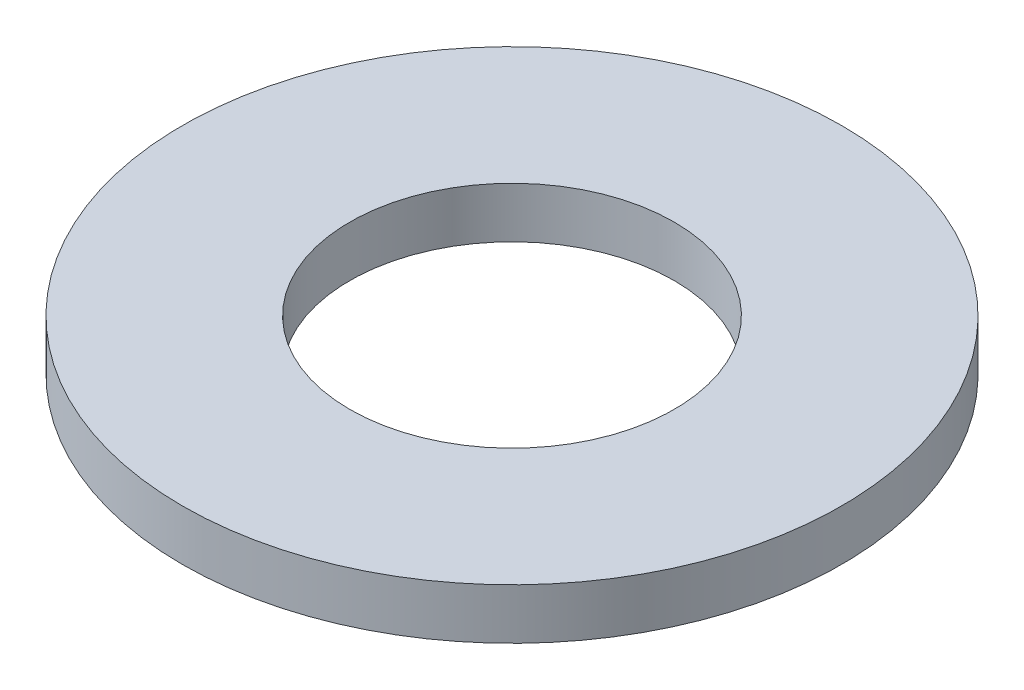
ISO-10303-21;
HEADER;
FILE_DESCRIPTION(('STEP AP214'),'2;1');
FILE_NAME('part.step','',(''),(''),'','','');
FILE_SCHEMA(('AUTOMOTIVE_DESIGN { 1 0 10303 214 1 1 1 1 }'));
ENDSEC;
DATA;
#1=APPLICATION_CONTEXT('core data for automotive mechanical design processes');
#2=APPLICATION_PROTOCOL_DEFINITION('international standard','automotive_design',2000,#1);
#3=PRODUCT_CONTEXT('',#1,'mechanical');
#4=PRODUCT('Part','Part','',(#3));
#5=PRODUCT_RELATED_PRODUCT_CATEGORY('part','',(#4));
#6=PRODUCT_DEFINITION_FORMATION('','',#4);
#7=PRODUCT_DEFINITION_CONTEXT('part definition',#1,'design');
#8=PRODUCT_DEFINITION('design','',#6,#7);
#9=PRODUCT_DEFINITION_SHAPE('','',#8);
#10=(LENGTH_UNIT() NAMED_UNIT(*) SI_UNIT(.MILLI.,.METRE.));
#11=(NAMED_UNIT(*) PLANE_ANGLE_UNIT() SI_UNIT($,.RADIAN.));
#12=(NAMED_UNIT(*) SI_UNIT($,.STERADIAN.) SOLID_ANGLE_UNIT());
#13=UNCERTAINTY_MEASURE_WITH_UNIT(LENGTH_MEASURE(1.E-05),#10,'distance_accuracy_value','');
#14=(GEOMETRIC_REPRESENTATION_CONTEXT(3) GLOBAL_UNCERTAINTY_ASSIGNED_CONTEXT((#13)) GLOBAL_UNIT_ASSIGNED_CONTEXT((#10,
#11,#12)) REPRESENTATION_CONTEXT('',''));
#15=CARTESIAN_POINT('',(0.,0.,0.));
#16=DIRECTION('',(0.,0.,1.));
#17=DIRECTION('',(1.,0.,0.));
#18=AXIS2_PLACEMENT_3D('',#15,#16,#17);
#19=CARTESIAN_POINT('',(0.,0.5,0.));
#20=DIRECTION('',(0.,1.,0.));
#21=DIRECTION('',(0.,0.,1.));
#22=AXIS2_PLACEMENT_3D('',#19,#20,#21);
#23=PLANE('',#22);
#24=CARTESIAN_POINT('',(0.,0.5,0.));
#25=DIRECTION('',(0.,1.,0.));
#26=DIRECTION('',(0.,0.,1.));
#27=AXIS2_PLACEMENT_3D('',#24,#25,#26);
#28=CIRCLE('',#27,3.25);
#29=CARTESIAN_POINT('',(0.,0.5,3.25));
#30=VERTEX_POINT('',#29);
#31=EDGE_CURVE('E10',#30,#30,#28,.T.);
#32=ORIENTED_EDGE('',*,*,#31,.T.);
#33=EDGE_LOOP('',(#32));
#34=FACE_BOUND('',#33,.T.);
#35=CARTESIAN_POINT('',(0.,0.5,0.));
#36=DIRECTION('',(0.,1.,0.));
#37=DIRECTION('',(0.,0.,1.));
#38=AXIS2_PLACEMENT_3D('',#35,#36,#37);
#39=CIRCLE('',#38,1.6);
#40=CARTESIAN_POINT('',(0.,0.5,1.6));
#41=VERTEX_POINT('',#40);
#42=EDGE_CURVE('E44',#41,#41,#39,.T.);
#43=ORIENTED_EDGE('',*,*,#42,.F.);
#44=EDGE_LOOP('',(#43));
#45=FACE_BOUND('',#44,.T.);
#46=ADVANCED_FACE('F33',(#34,#45),#23,.T.);
#47=CARTESIAN_POINT('',(0.,0.,0.));
#48=DIRECTION('',(0.,1.,0.));
#49=DIRECTION('',(0.,0.,1.));
#50=AXIS2_PLACEMENT_3D('',#47,#48,#49);
#51=PLANE('',#50);
#52=CARTESIAN_POINT('',(0.,0.,0.));
#53=DIRECTION('',(0.,1.,0.));
#54=DIRECTION('',(0.,0.,1.));
#55=AXIS2_PLACEMENT_3D('',#52,#53,#54);
#56=CIRCLE('',#55,3.25);
#57=CARTESIAN_POINT('',(0.,0.,3.25));
#58=VERTEX_POINT('',#57);
#59=EDGE_CURVE('E37',#58,#58,#56,.T.);
#60=ORIENTED_EDGE('',*,*,#59,.F.);
#61=EDGE_LOOP('',(#60));
#62=FACE_BOUND('',#61,.T.);
#63=CARTESIAN_POINT('',(0.,0.,0.));
#64=DIRECTION('',(0.,1.,0.));
#65=DIRECTION('',(0.,0.,1.));
#66=AXIS2_PLACEMENT_3D('',#63,#64,#65);
#67=CIRCLE('',#66,1.6);
#68=CARTESIAN_POINT('',(0.,0.,1.6));
#69=VERTEX_POINT('',#68);
#70=EDGE_CURVE('E46',#69,#69,#67,.T.);
#71=ORIENTED_EDGE('',*,*,#70,.T.);
#72=EDGE_LOOP('',(#71));
#73=FACE_BOUND('',#72,.T.);
#74=ADVANCED_FACE('F56',(#62,#73),#51,.F.);
#75=CARTESIAN_POINT('',(0.,0.5,0.));
#76=DIRECTION('',(0.,-1.,0.));
#77=DIRECTION('',(0.,0.,-1.));
#78=AXIS2_PLACEMENT_3D('',#75,#76,#77);
#79=CYLINDRICAL_SURFACE('',#78,3.25);
#80=ORIENTED_EDGE('',*,*,#31,.F.);
#81=EDGE_LOOP('',(#80));
#82=FACE_BOUND('',#81,.T.);
#83=ORIENTED_EDGE('',*,*,#59,.T.);
#84=EDGE_LOOP('',(#83));
#85=FACE_BOUND('',#84,.T.);
#86=ADVANCED_FACE('F35',(#82,#85),#79,.T.);
#87=CARTESIAN_POINT('',(0.,0.5,0.));
#88=DIRECTION('',(0.,-1.,0.));
#89=DIRECTION('',(0.,0.,-1.));
#90=AXIS2_PLACEMENT_3D('',#87,#88,#89);
#91=CYLINDRICAL_SURFACE('',#90,1.6);
#92=ORIENTED_EDGE('',*,*,#42,.T.);
#93=EDGE_LOOP('',(#92));
#94=FACE_BOUND('',#93,.T.);
#95=ORIENTED_EDGE('',*,*,#70,.F.);
#96=EDGE_LOOP('',(#95));
#97=FACE_BOUND('',#96,.T.);
#98=ADVANCED_FACE('F52',(#94,#97),#91,.F.);
#99=CLOSED_SHELL('',(#46,#74,#86,#98));
#100=MANIFOLD_SOLID_BREP('B2',#99);
#101=ADVANCED_BREP_SHAPE_REPRESENTATION('',(#18,#100),#14);
#102=SHAPE_DEFINITION_REPRESENTATION(#9,#101);
ENDSEC;
END-ISO-10303-21;
